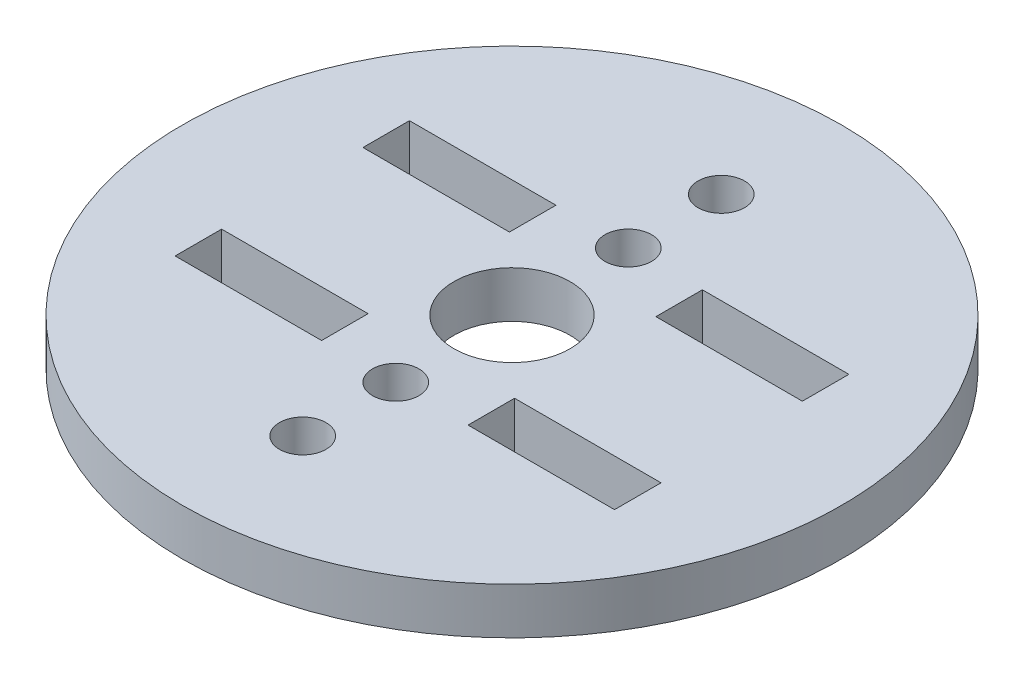
ISO-10303-21;
HEADER;
FILE_DESCRIPTION(('STEP AP214'),'2;1');
FILE_NAME('part.step','',(''),(''),'','','');
FILE_SCHEMA(('AUTOMOTIVE_DESIGN { 1 0 10303 214 1 1 1 1 }'));
ENDSEC;
DATA;
#1=APPLICATION_CONTEXT('core data for automotive mechanical design processes');
#2=APPLICATION_PROTOCOL_DEFINITION('international standard','automotive_design',2000,#1);
#3=PRODUCT_CONTEXT('',#1,'mechanical');
#4=PRODUCT('Part','Part','',(#3));
#5=PRODUCT_RELATED_PRODUCT_CATEGORY('part','',(#4));
#6=PRODUCT_DEFINITION_FORMATION('','',#4);
#7=PRODUCT_DEFINITION_CONTEXT('part definition',#1,'design');
#8=PRODUCT_DEFINITION('design','',#6,#7);
#9=PRODUCT_DEFINITION_SHAPE('','',#8);
#10=(LENGTH_UNIT() NAMED_UNIT(*) SI_UNIT(.MILLI.,.METRE.));
#11=(NAMED_UNIT(*) PLANE_ANGLE_UNIT() SI_UNIT($,.RADIAN.));
#12=(NAMED_UNIT(*) SI_UNIT($,.STERADIAN.) SOLID_ANGLE_UNIT());
#13=UNCERTAINTY_MEASURE_WITH_UNIT(LENGTH_MEASURE(1.E-05),#10,'distance_accuracy_value','');
#14=(GEOMETRIC_REPRESENTATION_CONTEXT(3) GLOBAL_UNCERTAINTY_ASSIGNED_CONTEXT((#13)) GLOBAL_UNIT_ASSIGNED_CONTEXT((#10,
#11,#12)) REPRESENTATION_CONTEXT('',''));
#15=CARTESIAN_POINT('',(0.,0.,0.));
#16=DIRECTION('',(0.,0.,1.));
#17=DIRECTION('',(1.,0.,0.));
#18=AXIS2_PLACEMENT_3D('',#15,#16,#17);
#19=CARTESIAN_POINT('',(0.,3.175,0.));
#20=DIRECTION('',(0.,1.,0.));
#21=DIRECTION('',(0.,0.,1.));
#22=AXIS2_PLACEMENT_3D('',#19,#20,#21);
#23=PLANE('',#22);
#24=CARTESIAN_POINT('',(0.,3.175,-14.2875));
#25=DIRECTION('',(0.,1.,0.));
#26=DIRECTION('',(0.,0.,1.));
#27=AXIS2_PLACEMENT_3D('',#24,#25,#26);
#28=CIRCLE('',#27,1.5875);
#29=CARTESIAN_POINT('',(0.,3.175,-12.7));
#30=VERTEX_POINT('',#29);
#31=EDGE_CURVE('E309',#30,#30,#28,.T.);
#32=ORIENTED_EDGE('',*,*,#31,.F.);
#33=EDGE_LOOP('',(#32));
#34=FACE_BOUND('',#33,.T.);
#35=CARTESIAN_POINT('',(0.,3.175,-7.9375));
#36=DIRECTION('',(0.,1.,0.));
#37=DIRECTION('',(0.,0.,1.));
#38=AXIS2_PLACEMENT_3D('',#35,#36,#37);
#39=CIRCLE('',#38,1.5875);
#40=CARTESIAN_POINT('',(0.,3.175,-6.35));
#41=VERTEX_POINT('',#40);
#42=EDGE_CURVE('E174',#41,#41,#39,.T.);
#43=ORIENTED_EDGE('',*,*,#42,.F.);
#44=EDGE_LOOP('',(#43));
#45=FACE_BOUND('',#44,.T.);
#46=DIRECTION('',(1.,0.,0.));
#47=VECTOR('',#46,1.);
#48=CARTESIAN_POINT('',(-15.,3.175,8.));
#49=LINE('',#48,#47);
#50=CARTESIAN_POINT('',(-15.,3.175,8.));
#51=VERTEX_POINT('',#50);
#52=CARTESIAN_POINT('',(-5.,3.175,8.));
#53=VERTEX_POINT('',#52);
#54=EDGE_CURVE('E186',#51,#53,#49,.T.);
#55=ORIENTED_EDGE('',*,*,#54,.F.);
#56=DIRECTION('',(0.,0.,1.));
#57=VECTOR('',#56,1.);
#58=CARTESIAN_POINT('',(-15.,3.175,4.825));
#59=LINE('',#58,#57);
#60=CARTESIAN_POINT('',(-15.,3.175,4.825));
#61=VERTEX_POINT('',#60);
#62=EDGE_CURVE('E184',#61,#51,#59,.T.);
#63=ORIENTED_EDGE('',*,*,#62,.F.);
#64=DIRECTION('',(-1.,0.,0.));
#65=VECTOR('',#64,1.);
#66=CARTESIAN_POINT('',(-15.,3.175,4.825));
#67=LINE('',#66,#65);
#68=CARTESIAN_POINT('',(-5.,3.175,4.825));
#69=VERTEX_POINT('',#68);
#70=EDGE_CURVE('E192',#69,#61,#67,.T.);
#71=ORIENTED_EDGE('',*,*,#70,.F.);
#72=DIRECTION('',(0.,0.,-1.));
#73=VECTOR('',#72,1.);
#74=CARTESIAN_POINT('',(-5.,3.175,4.825));
#75=LINE('',#74,#73);
#76=EDGE_CURVE('E189',#53,#69,#75,.T.);
#77=ORIENTED_EDGE('',*,*,#76,.F.);
#78=EDGE_LOOP('',(#55,#63,#71,#77));
#79=FACE_BOUND('',#78,.T.);
#80=DIRECTION('',(1.,0.,0.));
#81=VECTOR('',#80,1.);
#82=CARTESIAN_POINT('',(-15.,3.175,-4.825));
#83=LINE('',#82,#81);
#84=CARTESIAN_POINT('',(-15.,3.175,-4.825));
#85=VERTEX_POINT('',#84);
#86=CARTESIAN_POINT('',(-5.,3.175,-4.825));
#87=VERTEX_POINT('',#86);
#88=EDGE_CURVE('E248',#85,#87,#83,.T.);
#89=ORIENTED_EDGE('',*,*,#88,.F.);
#90=DIRECTION('',(0.,0.,1.));
#91=VECTOR('',#90,1.);
#92=CARTESIAN_POINT('',(-15.,3.175,-8.));
#93=LINE('',#92,#91);
#94=CARTESIAN_POINT('',(-15.,3.175,-8.));
#95=VERTEX_POINT('',#94);
#96=EDGE_CURVE('E246',#95,#85,#93,.T.);
#97=ORIENTED_EDGE('',*,*,#96,.F.);
#98=DIRECTION('',(-1.,0.,0.));
#99=VECTOR('',#98,1.);
#100=CARTESIAN_POINT('',(-15.,3.175,-8.));
#101=LINE('',#100,#99);
#102=CARTESIAN_POINT('',(-5.,3.175,-8.));
#103=VERTEX_POINT('',#102);
#104=EDGE_CURVE('E254',#103,#95,#101,.T.);
#105=ORIENTED_EDGE('',*,*,#104,.F.);
#106=DIRECTION('',(0.,0.,-1.));
#107=VECTOR('',#106,1.);
#108=CARTESIAN_POINT('',(-5.,3.175,-8.));
#109=LINE('',#108,#107);
#110=EDGE_CURVE('E251',#87,#103,#109,.T.);
#111=ORIENTED_EDGE('',*,*,#110,.F.);
#112=EDGE_LOOP('',(#89,#97,#105,#111));
#113=FACE_BOUND('',#112,.T.);
#114=CARTESIAN_POINT('',(0.,3.175,0.));
#115=DIRECTION('',(0.,1.,0.));
#116=DIRECTION('',(0.,0.,1.));
#117=AXIS2_PLACEMENT_3D('',#114,#115,#116);
#118=CIRCLE('',#117,22.5);
#119=CARTESIAN_POINT('',(0.,3.175,22.5));
#120=VERTEX_POINT('',#119);
#121=EDGE_CURVE('E11',#120,#120,#118,.T.);
#122=ORIENTED_EDGE('',*,*,#121,.T.);
#123=EDGE_LOOP('',(#122));
#124=FACE_BOUND('',#123,.T.);
#125=CARTESIAN_POINT('',(0.,3.175,0.));
#126=DIRECTION('',(0.,1.,0.));
#127=DIRECTION('',(0.,0.,1.));
#128=AXIS2_PLACEMENT_3D('',#125,#126,#127);
#129=CIRCLE('',#128,3.96875);
#130=CARTESIAN_POINT('',(0.,3.175,3.96875));
#131=VERTEX_POINT('',#130);
#132=EDGE_CURVE('E277',#131,#131,#129,.T.);
#133=ORIENTED_EDGE('',*,*,#132,.F.);
#134=EDGE_LOOP('',(#133));
#135=FACE_BOUND('',#134,.T.);
#136=DIRECTION('',(1.,0.,0.));
#137=VECTOR('',#136,1.);
#138=CARTESIAN_POINT('',(5.,3.175,-4.825));
#139=LINE('',#138,#137);
#140=CARTESIAN_POINT('',(5.,3.175,-4.825));
#141=VERTEX_POINT('',#140);
#142=CARTESIAN_POINT('',(15.,3.175,-4.825));
#143=VERTEX_POINT('',#142);
#144=EDGE_CURVE('E217',#141,#143,#139,.T.);
#145=ORIENTED_EDGE('',*,*,#144,.F.);
#146=DIRECTION('',(0.,0.,1.));
#147=VECTOR('',#146,1.);
#148=CARTESIAN_POINT('',(5.,3.175,-8.));
#149=LINE('',#148,#147);
#150=CARTESIAN_POINT('',(5.,3.175,-8.));
#151=VERTEX_POINT('',#150);
#152=EDGE_CURVE('E215',#151,#141,#149,.T.);
#153=ORIENTED_EDGE('',*,*,#152,.F.);
#154=DIRECTION('',(-1.,0.,0.));
#155=VECTOR('',#154,1.);
#156=CARTESIAN_POINT('',(5.,3.175,-8.));
#157=LINE('',#156,#155);
#158=CARTESIAN_POINT('',(15.,3.175,-8.));
#159=VERTEX_POINT('',#158);
#160=EDGE_CURVE('E223',#159,#151,#157,.T.);
#161=ORIENTED_EDGE('',*,*,#160,.F.);
#162=DIRECTION('',(0.,0.,-1.));
#163=VECTOR('',#162,1.);
#164=CARTESIAN_POINT('',(15.,3.175,-8.));
#165=LINE('',#164,#163);
#166=EDGE_CURVE('E220',#143,#159,#165,.T.);
#167=ORIENTED_EDGE('',*,*,#166,.F.);
#168=EDGE_LOOP('',(#145,#153,#161,#167));
#169=FACE_BOUND('',#168,.T.);
#170=DIRECTION('',(1.,0.,0.));
#171=VECTOR('',#170,1.);
#172=CARTESIAN_POINT('',(5.,3.175,8.));
#173=LINE('',#172,#171);
#174=CARTESIAN_POINT('',(5.,3.175,8.));
#175=VERTEX_POINT('',#174);
#176=CARTESIAN_POINT('',(15.,3.175,8.));
#177=VERTEX_POINT('',#176);
#178=EDGE_CURVE('E153',#175,#177,#173,.T.);
#179=ORIENTED_EDGE('',*,*,#178,.F.);
#180=DIRECTION('',(0.,0.,1.));
#181=VECTOR('',#180,1.);
#182=CARTESIAN_POINT('',(5.,3.175,4.825));
#183=LINE('',#182,#181);
#184=CARTESIAN_POINT('',(5.,3.175,4.825));
#185=VERTEX_POINT('',#184);
#186=EDGE_CURVE('E145',#185,#175,#183,.T.);
#187=ORIENTED_EDGE('',*,*,#186,.F.);
#188=DIRECTION('',(-1.,0.,0.));
#189=VECTOR('',#188,1.);
#190=CARTESIAN_POINT('',(5.,3.175,4.825));
#191=LINE('',#190,#189);
#192=CARTESIAN_POINT('',(15.,3.175,4.825));
#193=VERTEX_POINT('',#192);
#194=EDGE_CURVE('E168',#193,#185,#191,.T.);
#195=ORIENTED_EDGE('',*,*,#194,.F.);
#196=DIRECTION('',(0.,0.,-1.));
#197=VECTOR('',#196,1.);
#198=CARTESIAN_POINT('',(15.,3.175,4.825));
#199=LINE('',#198,#197);
#200=EDGE_CURVE('E166',#177,#193,#199,.T.);
#201=ORIENTED_EDGE('',*,*,#200,.F.);
#202=EDGE_LOOP('',(#179,#187,#195,#201));
#203=FACE_BOUND('',#202,.T.);
#204=CARTESIAN_POINT('',(0.,3.175,7.9375));
#205=DIRECTION('',(0.,1.,0.));
#206=DIRECTION('',(0.,0.,1.));
#207=AXIS2_PLACEMENT_3D('',#204,#205,#206);
#208=CIRCLE('',#207,1.5875);
#209=CARTESIAN_POINT('',(0.,3.175,9.525));
#210=VERTEX_POINT('',#209);
#211=EDGE_CURVE('E538',#210,#210,#208,.T.);
#212=ORIENTED_EDGE('',*,*,#211,.F.);
#213=EDGE_LOOP('',(#212));
#214=FACE_BOUND('',#213,.T.);
#215=CARTESIAN_POINT('',(0.,3.175,14.2875));
#216=DIRECTION('',(0.,1.,0.));
#217=DIRECTION('',(0.,0.,1.));
#218=AXIS2_PLACEMENT_3D('',#215,#216,#217);
#219=CIRCLE('',#218,1.5875);
#220=CARTESIAN_POINT('',(0.,3.175,15.875));
#221=VERTEX_POINT('',#220);
#222=EDGE_CURVE('E525',#221,#221,#219,.T.);
#223=ORIENTED_EDGE('',*,*,#222,.F.);
#224=EDGE_LOOP('',(#223));
#225=FACE_BOUND('',#224,.T.);
#226=ADVANCED_FACE('F32',(#34,#45,#79,#113,#124,#135,#169,#203,#214,#225),#23,.T.);
#227=CARTESIAN_POINT('',(0.,0.,0.));
#228=DIRECTION('',(0.,1.,0.));
#229=DIRECTION('',(0.,0.,1.));
#230=AXIS2_PLACEMENT_3D('',#227,#228,#229);
#231=PLANE('',#230);
#232=CARTESIAN_POINT('',(0.,0.,-14.2875));
#233=DIRECTION('',(0.,1.,0.));
#234=DIRECTION('',(0.,0.,1.));
#235=AXIS2_PLACEMENT_3D('',#232,#233,#234);
#236=CIRCLE('',#235,1.5875);
#237=CARTESIAN_POINT('',(0.,0.,-12.7));
#238=VERTEX_POINT('',#237);
#239=EDGE_CURVE('E531',#238,#238,#236,.T.);
#240=ORIENTED_EDGE('',*,*,#239,.T.);
#241=EDGE_LOOP('',(#240));
#242=FACE_BOUND('',#241,.T.);
#243=CARTESIAN_POINT('',(0.,0.,-7.9375));
#244=DIRECTION('',(0.,1.,0.));
#245=DIRECTION('',(0.,0.,1.));
#246=AXIS2_PLACEMENT_3D('',#243,#244,#245);
#247=CIRCLE('',#246,1.5875);
#248=CARTESIAN_POINT('',(0.,0.,-6.35));
#249=VERTEX_POINT('',#248);
#250=EDGE_CURVE('E541',#249,#249,#247,.T.);
#251=ORIENTED_EDGE('',*,*,#250,.T.);
#252=EDGE_LOOP('',(#251));
#253=FACE_BOUND('',#252,.T.);
#254=DIRECTION('',(0.,0.,1.));
#255=VECTOR('',#254,1.);
#256=CARTESIAN_POINT('',(-15.,0.,4.825));
#257=LINE('',#256,#255);
#258=CARTESIAN_POINT('',(-15.,0.,4.825));
#259=VERTEX_POINT('',#258);
#260=CARTESIAN_POINT('',(-15.,0.,8.));
#261=VERTEX_POINT('',#260);
#262=EDGE_CURVE('E161',#259,#261,#257,.T.);
#263=ORIENTED_EDGE('',*,*,#262,.T.);
#264=DIRECTION('',(1.,0.,0.));
#265=VECTOR('',#264,1.);
#266=CARTESIAN_POINT('',(-15.,0.,8.));
#267=LINE('',#266,#265);
#268=CARTESIAN_POINT('',(-5.,0.,8.));
#269=VERTEX_POINT('',#268);
#270=EDGE_CURVE('E197',#261,#269,#267,.T.);
#271=ORIENTED_EDGE('',*,*,#270,.T.);
#272=DIRECTION('',(0.,0.,-1.));
#273=VECTOR('',#272,1.);
#274=CARTESIAN_POINT('',(-5.,0.,4.825));
#275=LINE('',#274,#273);
#276=CARTESIAN_POINT('',(-5.,0.,4.825));
#277=VERTEX_POINT('',#276);
#278=EDGE_CURVE('E200',#269,#277,#275,.T.);
#279=ORIENTED_EDGE('',*,*,#278,.T.);
#280=DIRECTION('',(-1.,0.,0.));
#281=VECTOR('',#280,1.);
#282=CARTESIAN_POINT('',(-15.,0.,4.825));
#283=LINE('',#282,#281);
#284=EDGE_CURVE('E187',#277,#259,#283,.T.);
#285=ORIENTED_EDGE('',*,*,#284,.T.);
#286=EDGE_LOOP('',(#263,#271,#279,#285));
#287=FACE_BOUND('',#286,.T.);
#288=DIRECTION('',(0.,0.,1.));
#289=VECTOR('',#288,1.);
#290=CARTESIAN_POINT('',(-15.,0.,-8.));
#291=LINE('',#290,#289);
#292=CARTESIAN_POINT('',(-15.,0.,-8.));
#293=VERTEX_POINT('',#292);
#294=CARTESIAN_POINT('',(-15.,0.,-4.825));
#295=VERTEX_POINT('',#294);
#296=EDGE_CURVE('E245',#293,#295,#291,.T.);
#297=ORIENTED_EDGE('',*,*,#296,.T.);
#298=DIRECTION('',(1.,0.,0.));
#299=VECTOR('',#298,1.);
#300=CARTESIAN_POINT('',(-15.,0.,-4.825));
#301=LINE('',#300,#299);
#302=CARTESIAN_POINT('',(-5.,0.,-4.825));
#303=VERTEX_POINT('',#302);
#304=EDGE_CURVE('E259',#295,#303,#301,.T.);
#305=ORIENTED_EDGE('',*,*,#304,.T.);
#306=DIRECTION('',(0.,0.,-1.));
#307=VECTOR('',#306,1.);
#308=CARTESIAN_POINT('',(-5.,0.,-8.));
#309=LINE('',#308,#307);
#310=CARTESIAN_POINT('',(-5.,0.,-8.));
#311=VERTEX_POINT('',#310);
#312=EDGE_CURVE('E262',#303,#311,#309,.T.);
#313=ORIENTED_EDGE('',*,*,#312,.T.);
#314=DIRECTION('',(-1.,0.,0.));
#315=VECTOR('',#314,1.);
#316=CARTESIAN_POINT('',(-15.,0.,-8.));
#317=LINE('',#316,#315);
#318=EDGE_CURVE('E249',#311,#293,#317,.T.);
#319=ORIENTED_EDGE('',*,*,#318,.T.);
#320=EDGE_LOOP('',(#297,#305,#313,#319));
#321=FACE_BOUND('',#320,.T.);
#322=CARTESIAN_POINT('',(0.,0.,0.));
#323=DIRECTION('',(0.,1.,0.));
#324=DIRECTION('',(0.,0.,1.));
#325=AXIS2_PLACEMENT_3D('',#322,#323,#324);
#326=CIRCLE('',#325,22.5);
#327=CARTESIAN_POINT('',(0.,0.,22.5));
#328=VERTEX_POINT('',#327);
#329=EDGE_CURVE('E36',#328,#328,#326,.T.);
#330=ORIENTED_EDGE('',*,*,#329,.F.);
#331=EDGE_LOOP('',(#330));
#332=FACE_BOUND('',#331,.T.);
#333=CARTESIAN_POINT('',(0.,0.,0.));
#334=DIRECTION('',(0.,1.,0.));
#335=DIRECTION('',(0.,0.,1.));
#336=AXIS2_PLACEMENT_3D('',#333,#334,#335);
#337=CIRCLE('',#336,3.96875);
#338=CARTESIAN_POINT('',(0.,0.,3.96875));
#339=VERTEX_POINT('',#338);
#340=EDGE_CURVE('E276',#339,#339,#337,.T.);
#341=ORIENTED_EDGE('',*,*,#340,.T.);
#342=EDGE_LOOP('',(#341));
#343=FACE_BOUND('',#342,.T.);
#344=DIRECTION('',(0.,0.,1.));
#345=VECTOR('',#344,1.);
#346=CARTESIAN_POINT('',(5.,0.,-8.));
#347=LINE('',#346,#345);
#348=CARTESIAN_POINT('',(5.,0.,-8.));
#349=VERTEX_POINT('',#348);
#350=CARTESIAN_POINT('',(5.,0.,-4.825));
#351=VERTEX_POINT('',#350);
#352=EDGE_CURVE('E214',#349,#351,#347,.T.);
#353=ORIENTED_EDGE('',*,*,#352,.T.);
#354=DIRECTION('',(1.,0.,0.));
#355=VECTOR('',#354,1.);
#356=CARTESIAN_POINT('',(5.,0.,-4.825));
#357=LINE('',#356,#355);
#358=CARTESIAN_POINT('',(15.,0.,-4.825));
#359=VERTEX_POINT('',#358);
#360=EDGE_CURVE('E228',#351,#359,#357,.T.);
#361=ORIENTED_EDGE('',*,*,#360,.T.);
#362=DIRECTION('',(0.,0.,-1.));
#363=VECTOR('',#362,1.);
#364=CARTESIAN_POINT('',(15.,0.,-8.));
#365=LINE('',#364,#363);
#366=CARTESIAN_POINT('',(15.,0.,-8.));
#367=VERTEX_POINT('',#366);
#368=EDGE_CURVE('E231',#359,#367,#365,.T.);
#369=ORIENTED_EDGE('',*,*,#368,.T.);
#370=DIRECTION('',(-1.,0.,0.));
#371=VECTOR('',#370,1.);
#372=CARTESIAN_POINT('',(5.,0.,-8.));
#373=LINE('',#372,#371);
#374=EDGE_CURVE('E218',#367,#349,#373,.T.);
#375=ORIENTED_EDGE('',*,*,#374,.T.);
#376=EDGE_LOOP('',(#353,#361,#369,#375));
#377=FACE_BOUND('',#376,.T.);
#378=DIRECTION('',(0.,0.,1.));
#379=VECTOR('',#378,1.);
#380=CARTESIAN_POINT('',(5.,0.,4.825));
#381=LINE('',#380,#379);
#382=CARTESIAN_POINT('',(5.,0.,4.825));
#383=VERTEX_POINT('',#382);
#384=CARTESIAN_POINT('',(5.,0.,8.));
#385=VERTEX_POINT('',#384);
#386=EDGE_CURVE('E55',#383,#385,#381,.T.);
#387=ORIENTED_EDGE('',*,*,#386,.T.);
#388=DIRECTION('',(1.,0.,0.));
#389=VECTOR('',#388,1.);
#390=CARTESIAN_POINT('',(5.,0.,8.));
#391=LINE('',#390,#389);
#392=CARTESIAN_POINT('',(15.,0.,8.));
#393=VERTEX_POINT('',#392);
#394=EDGE_CURVE('E160',#385,#393,#391,.T.);
#395=ORIENTED_EDGE('',*,*,#394,.T.);
#396=DIRECTION('',(0.,0.,-1.));
#397=VECTOR('',#396,1.);
#398=CARTESIAN_POINT('',(15.,0.,4.825));
#399=LINE('',#398,#397);
#400=CARTESIAN_POINT('',(15.,0.,4.825));
#401=VERTEX_POINT('',#400);
#402=EDGE_CURVE('E176',#393,#401,#399,.T.);
#403=ORIENTED_EDGE('',*,*,#402,.T.);
#404=DIRECTION('',(-1.,0.,0.));
#405=VECTOR('',#404,1.);
#406=CARTESIAN_POINT('',(5.,0.,4.825));
#407=LINE('',#406,#405);
#408=EDGE_CURVE('E154',#401,#383,#407,.T.);
#409=ORIENTED_EDGE('',*,*,#408,.T.);
#410=EDGE_LOOP('',(#387,#395,#403,#409));
#411=FACE_BOUND('',#410,.T.);
#412=CARTESIAN_POINT('',(0.,0.,7.9375));
#413=DIRECTION('',(0.,1.,0.));
#414=DIRECTION('',(0.,0.,1.));
#415=AXIS2_PLACEMENT_3D('',#412,#413,#414);
#416=CIRCLE('',#415,1.5875);
#417=CARTESIAN_POINT('',(0.,0.,9.525));
#418=VERTEX_POINT('',#417);
#419=EDGE_CURVE('E535',#418,#418,#416,.T.);
#420=ORIENTED_EDGE('',*,*,#419,.T.);
#421=EDGE_LOOP('',(#420));
#422=FACE_BOUND('',#421,.T.);
#423=CARTESIAN_POINT('',(0.,0.,14.2875));
#424=DIRECTION('',(0.,1.,0.));
#425=DIRECTION('',(0.,0.,1.));
#426=AXIS2_PLACEMENT_3D('',#423,#424,#425);
#427=CIRCLE('',#426,1.5875);
#428=CARTESIAN_POINT('',(0.,0.,15.875));
#429=VERTEX_POINT('',#428);
#430=EDGE_CURVE('E528',#429,#429,#427,.T.);
#431=ORIENTED_EDGE('',*,*,#430,.T.);
#432=EDGE_LOOP('',(#431));
#433=FACE_BOUND('',#432,.T.);
#434=ADVANCED_FACE('F283',(#242,#253,#287,#321,#332,#343,#377,#411,#422,#433),#231,.F.);
#435=CARTESIAN_POINT('',(0.,3.175,0.));
#436=DIRECTION('',(0.,-1.,0.));
#437=DIRECTION('',(0.,0.,-1.));
#438=AXIS2_PLACEMENT_3D('',#435,#436,#437);
#439=CYLINDRICAL_SURFACE('',#438,22.5);
#440=ORIENTED_EDGE('',*,*,#121,.F.);
#441=EDGE_LOOP('',(#440));
#442=FACE_BOUND('',#441,.T.);
#443=ORIENTED_EDGE('',*,*,#329,.T.);
#444=EDGE_LOOP('',(#443));
#445=FACE_BOUND('',#444,.T.);
#446=ADVANCED_FACE('F34',(#442,#445),#439,.T.);
#447=CARTESIAN_POINT('',(0.,3.175,0.));
#448=DIRECTION('',(0.,-1.,0.));
#449=DIRECTION('',(0.,0.,-1.));
#450=AXIS2_PLACEMENT_3D('',#447,#448,#449);
#451=CYLINDRICAL_SURFACE('',#450,3.96875);
#452=ORIENTED_EDGE('',*,*,#132,.T.);
#453=EDGE_LOOP('',(#452));
#454=FACE_BOUND('',#453,.T.);
#455=ORIENTED_EDGE('',*,*,#340,.F.);
#456=EDGE_LOOP('',(#455));
#457=FACE_BOUND('',#456,.T.);
#458=ADVANCED_FACE('F286',(#454,#457),#451,.F.);
#459=CARTESIAN_POINT('',(-15.,3.175,-8.));
#460=DIRECTION('',(1.,0.,0.));
#461=DIRECTION('',(0.,0.,-1.));
#462=AXIS2_PLACEMENT_3D('',#459,#460,#461);
#463=PLANE('',#462);
#464=ORIENTED_EDGE('',*,*,#296,.F.);
#465=DIRECTION('',(0.,-1.,0.));
#466=VECTOR('',#465,1.);
#467=CARTESIAN_POINT('',(-15.,3.175,-8.));
#468=LINE('',#467,#466);
#469=EDGE_CURVE('E256',#95,#293,#468,.T.);
#470=ORIENTED_EDGE('',*,*,#469,.F.);
#471=ORIENTED_EDGE('',*,*,#96,.T.);
#472=DIRECTION('',(0.,-1.,0.));
#473=VECTOR('',#472,1.);
#474=CARTESIAN_POINT('',(-15.,3.175,-4.825));
#475=LINE('',#474,#473);
#476=EDGE_CURVE('E273',#85,#295,#475,.T.);
#477=ORIENTED_EDGE('',*,*,#476,.T.);
#478=EDGE_LOOP('',(#464,#470,#471,#477));
#479=FACE_BOUND('',#478,.T.);
#480=ADVANCED_FACE('F288',(#479),#463,.T.);
#481=CARTESIAN_POINT('',(-15.,3.175,-4.825));
#482=DIRECTION('',(0.,0.,-1.));
#483=DIRECTION('',(-1.,0.,0.));
#484=AXIS2_PLACEMENT_3D('',#481,#482,#483);
#485=PLANE('',#484);
#486=ORIENTED_EDGE('',*,*,#304,.F.);
#487=ORIENTED_EDGE('',*,*,#476,.F.);
#488=ORIENTED_EDGE('',*,*,#88,.T.);
#489=DIRECTION('',(0.,-1.,0.));
#490=VECTOR('',#489,1.);
#491=CARTESIAN_POINT('',(-5.,3.175,-4.825));
#492=LINE('',#491,#490);
#493=EDGE_CURVE('E271',#87,#303,#492,.T.);
#494=ORIENTED_EDGE('',*,*,#493,.T.);
#495=EDGE_LOOP('',(#486,#487,#488,#494));
#496=FACE_BOUND('',#495,.T.);
#497=ADVANCED_FACE('F295',(#496),#485,.T.);
#498=CARTESIAN_POINT('',(-5.,3.175,-8.));
#499=DIRECTION('',(-1.,0.,0.));
#500=DIRECTION('',(0.,0.,1.));
#501=AXIS2_PLACEMENT_3D('',#498,#499,#500);
#502=PLANE('',#501);
#503=ORIENTED_EDGE('',*,*,#312,.F.);
#504=ORIENTED_EDGE('',*,*,#493,.F.);
#505=ORIENTED_EDGE('',*,*,#110,.T.);
#506=DIRECTION('',(0.,-1.,0.));
#507=VECTOR('',#506,1.);
#508=CARTESIAN_POINT('',(-5.,3.175,-8.));
#509=LINE('',#508,#507);
#510=EDGE_CURVE('E269',#103,#311,#509,.T.);
#511=ORIENTED_EDGE('',*,*,#510,.T.);
#512=EDGE_LOOP('',(#503,#504,#505,#511));
#513=FACE_BOUND('',#512,.T.);
#514=ADVANCED_FACE('F363',(#513),#502,.T.);
#515=CARTESIAN_POINT('',(-15.,3.175,-8.));
#516=DIRECTION('',(0.,0.,1.));
#517=DIRECTION('',(1.,0.,0.));
#518=AXIS2_PLACEMENT_3D('',#515,#516,#517);
#519=PLANE('',#518);
#520=ORIENTED_EDGE('',*,*,#318,.F.);
#521=ORIENTED_EDGE('',*,*,#510,.F.);
#522=ORIENTED_EDGE('',*,*,#104,.T.);
#523=ORIENTED_EDGE('',*,*,#469,.T.);
#524=EDGE_LOOP('',(#520,#521,#522,#523));
#525=FACE_BOUND('',#524,.T.);
#526=ADVANCED_FACE('F360',(#525),#519,.T.);
#527=CARTESIAN_POINT('',(5.,3.175,-8.));
#528=DIRECTION('',(1.,0.,0.));
#529=DIRECTION('',(0.,0.,-1.));
#530=AXIS2_PLACEMENT_3D('',#527,#528,#529);
#531=PLANE('',#530);
#532=ORIENTED_EDGE('',*,*,#352,.F.);
#533=DIRECTION('',(0.,-1.,0.));
#534=VECTOR('',#533,1.);
#535=CARTESIAN_POINT('',(5.,3.175,-8.));
#536=LINE('',#535,#534);
#537=EDGE_CURVE('E225',#151,#349,#536,.T.);
#538=ORIENTED_EDGE('',*,*,#537,.F.);
#539=ORIENTED_EDGE('',*,*,#152,.T.);
#540=DIRECTION('',(0.,-1.,0.));
#541=VECTOR('',#540,1.);
#542=CARTESIAN_POINT('',(5.,3.175,-4.825));
#543=LINE('',#542,#541);
#544=EDGE_CURVE('E242',#141,#351,#543,.T.);
#545=ORIENTED_EDGE('',*,*,#544,.T.);
#546=EDGE_LOOP('',(#532,#538,#539,#545));
#547=FACE_BOUND('',#546,.T.);
#548=ADVANCED_FACE('F339',(#547),#531,.T.);
#549=CARTESIAN_POINT('',(5.,3.175,-4.825));
#550=DIRECTION('',(0.,0.,-1.));
#551=DIRECTION('',(-1.,0.,0.));
#552=AXIS2_PLACEMENT_3D('',#549,#550,#551);
#553=PLANE('',#552);
#554=ORIENTED_EDGE('',*,*,#360,.F.);
#555=ORIENTED_EDGE('',*,*,#544,.F.);
#556=ORIENTED_EDGE('',*,*,#144,.T.);
#557=DIRECTION('',(0.,-1.,0.));
#558=VECTOR('',#557,1.);
#559=CARTESIAN_POINT('',(15.,3.175,-4.825));
#560=LINE('',#559,#558);
#561=EDGE_CURVE('E240',#143,#359,#560,.T.);
#562=ORIENTED_EDGE('',*,*,#561,.T.);
#563=EDGE_LOOP('',(#554,#555,#556,#562));
#564=FACE_BOUND('',#563,.T.);
#565=ADVANCED_FACE('F332',(#564),#553,.T.);
#566=CARTESIAN_POINT('',(15.,3.175,-8.));
#567=DIRECTION('',(-1.,0.,0.));
#568=DIRECTION('',(0.,0.,1.));
#569=AXIS2_PLACEMENT_3D('',#566,#567,#568);
#570=PLANE('',#569);
#571=ORIENTED_EDGE('',*,*,#368,.F.);
#572=ORIENTED_EDGE('',*,*,#561,.F.);
#573=ORIENTED_EDGE('',*,*,#166,.T.);
#574=DIRECTION('',(0.,-1.,0.));
#575=VECTOR('',#574,1.);
#576=CARTESIAN_POINT('',(15.,3.175,-8.));
#577=LINE('',#576,#575);
#578=EDGE_CURVE('E238',#159,#367,#577,.T.);
#579=ORIENTED_EDGE('',*,*,#578,.T.);
#580=EDGE_LOOP('',(#571,#572,#573,#579));
#581=FACE_BOUND('',#580,.T.);
#582=ADVANCED_FACE('F335',(#581),#570,.T.);
#583=CARTESIAN_POINT('',(5.,3.175,-8.));
#584=DIRECTION('',(0.,0.,1.));
#585=DIRECTION('',(1.,0.,0.));
#586=AXIS2_PLACEMENT_3D('',#583,#584,#585);
#587=PLANE('',#586);
#588=ORIENTED_EDGE('',*,*,#374,.F.);
#589=ORIENTED_EDGE('',*,*,#578,.F.);
#590=ORIENTED_EDGE('',*,*,#160,.T.);
#591=ORIENTED_EDGE('',*,*,#537,.T.);
#592=EDGE_LOOP('',(#588,#589,#590,#591));
#593=FACE_BOUND('',#592,.T.);
#594=ADVANCED_FACE('F342',(#593),#587,.T.);
#595=CARTESIAN_POINT('',(-15.,3.175,4.825));
#596=DIRECTION('',(1.,0.,0.));
#597=DIRECTION('',(0.,0.,-1.));
#598=AXIS2_PLACEMENT_3D('',#595,#596,#597);
#599=PLANE('',#598);
#600=ORIENTED_EDGE('',*,*,#262,.F.);
#601=DIRECTION('',(0.,-1.,0.));
#602=VECTOR('',#601,1.);
#603=CARTESIAN_POINT('',(-15.,3.175,4.825));
#604=LINE('',#603,#602);
#605=EDGE_CURVE('E194',#61,#259,#604,.T.);
#606=ORIENTED_EDGE('',*,*,#605,.F.);
#607=ORIENTED_EDGE('',*,*,#62,.T.);
#608=DIRECTION('',(0.,-1.,0.));
#609=VECTOR('',#608,1.);
#610=CARTESIAN_POINT('',(-15.,3.175,8.));
#611=LINE('',#610,#609);
#612=EDGE_CURVE('E211',#51,#261,#611,.T.);
#613=ORIENTED_EDGE('',*,*,#612,.T.);
#614=EDGE_LOOP('',(#600,#606,#607,#613));
#615=FACE_BOUND('',#614,.T.);
#616=ADVANCED_FACE('F344',(#615),#599,.T.);
#617=CARTESIAN_POINT('',(-15.,3.175,8.));
#618=DIRECTION('',(0.,0.,-1.));
#619=DIRECTION('',(-1.,0.,0.));
#620=AXIS2_PLACEMENT_3D('',#617,#618,#619);
#621=PLANE('',#620);
#622=ORIENTED_EDGE('',*,*,#270,.F.);
#623=ORIENTED_EDGE('',*,*,#612,.F.);
#624=ORIENTED_EDGE('',*,*,#54,.T.);
#625=DIRECTION('',(0.,-1.,0.));
#626=VECTOR('',#625,1.);
#627=CARTESIAN_POINT('',(-5.,3.175,8.));
#628=LINE('',#627,#626);
#629=EDGE_CURVE('E209',#53,#269,#628,.T.);
#630=ORIENTED_EDGE('',*,*,#629,.T.);
#631=EDGE_LOOP('',(#622,#623,#624,#630));
#632=FACE_BOUND('',#631,.T.);
#633=ADVANCED_FACE('F350',(#632),#621,.T.);
#634=CARTESIAN_POINT('',(-5.,3.175,4.825));
#635=DIRECTION('',(-1.,0.,0.));
#636=DIRECTION('',(0.,0.,1.));
#637=AXIS2_PLACEMENT_3D('',#634,#635,#636);
#638=PLANE('',#637);
#639=ORIENTED_EDGE('',*,*,#278,.F.);
#640=ORIENTED_EDGE('',*,*,#629,.F.);
#641=ORIENTED_EDGE('',*,*,#76,.T.);
#642=DIRECTION('',(0.,-1.,0.));
#643=VECTOR('',#642,1.);
#644=CARTESIAN_POINT('',(-5.,3.175,4.825));
#645=LINE('',#644,#643);
#646=EDGE_CURVE('E207',#69,#277,#645,.T.);
#647=ORIENTED_EDGE('',*,*,#646,.T.);
#648=EDGE_LOOP('',(#639,#640,#641,#647));
#649=FACE_BOUND('',#648,.T.);
#650=ADVANCED_FACE('F424',(#649),#638,.T.);
#651=CARTESIAN_POINT('',(-15.,3.175,4.825));
#652=DIRECTION('',(0.,0.,1.));
#653=DIRECTION('',(1.,0.,0.));
#654=AXIS2_PLACEMENT_3D('',#651,#652,#653);
#655=PLANE('',#654);
#656=ORIENTED_EDGE('',*,*,#284,.F.);
#657=ORIENTED_EDGE('',*,*,#646,.F.);
#658=ORIENTED_EDGE('',*,*,#70,.T.);
#659=ORIENTED_EDGE('',*,*,#605,.T.);
#660=EDGE_LOOP('',(#656,#657,#658,#659));
#661=FACE_BOUND('',#660,.T.);
#662=ADVANCED_FACE('F433',(#661),#655,.T.);
#663=CARTESIAN_POINT('',(5.,3.175,4.825));
#664=DIRECTION('',(1.,0.,0.));
#665=DIRECTION('',(0.,0.,-1.));
#666=AXIS2_PLACEMENT_3D('',#663,#664,#665);
#667=PLANE('',#666);
#668=ORIENTED_EDGE('',*,*,#386,.F.);
#669=DIRECTION('',(0.,-1.,0.));
#670=VECTOR('',#669,1.);
#671=CARTESIAN_POINT('',(5.,3.175,4.825));
#672=LINE('',#671,#670);
#673=EDGE_CURVE('E149',#185,#383,#672,.T.);
#674=ORIENTED_EDGE('',*,*,#673,.F.);
#675=ORIENTED_EDGE('',*,*,#186,.T.);
#676=DIRECTION('',(0.,-1.,0.));
#677=VECTOR('',#676,1.);
#678=CARTESIAN_POINT('',(5.,3.175,8.));
#679=LINE('',#678,#677);
#680=EDGE_CURVE('E148',#175,#385,#679,.T.);
#681=ORIENTED_EDGE('',*,*,#680,.T.);
#682=EDGE_LOOP('',(#668,#674,#675,#681));
#683=FACE_BOUND('',#682,.T.);
#684=ADVANCED_FACE('F147',(#683),#667,.T.);
#685=CARTESIAN_POINT('',(5.,3.175,8.));
#686=DIRECTION('',(0.,0.,-1.));
#687=DIRECTION('',(-1.,0.,0.));
#688=AXIS2_PLACEMENT_3D('',#685,#686,#687);
#689=PLANE('',#688);
#690=ORIENTED_EDGE('',*,*,#394,.F.);
#691=ORIENTED_EDGE('',*,*,#680,.F.);
#692=ORIENTED_EDGE('',*,*,#178,.T.);
#693=DIRECTION('',(0.,-1.,0.));
#694=VECTOR('',#693,1.);
#695=CARTESIAN_POINT('',(15.,3.175,8.));
#696=LINE('',#695,#694);
#697=EDGE_CURVE('E162',#177,#393,#696,.T.);
#698=ORIENTED_EDGE('',*,*,#697,.T.);
#699=EDGE_LOOP('',(#690,#691,#692,#698));
#700=FACE_BOUND('',#699,.T.);
#701=ADVANCED_FACE('F157',(#700),#689,.T.);
#702=CARTESIAN_POINT('',(15.,3.175,4.825));
#703=DIRECTION('',(-1.,0.,0.));
#704=DIRECTION('',(0.,0.,1.));
#705=AXIS2_PLACEMENT_3D('',#702,#703,#704);
#706=PLANE('',#705);
#707=ORIENTED_EDGE('',*,*,#402,.F.);
#708=ORIENTED_EDGE('',*,*,#697,.F.);
#709=ORIENTED_EDGE('',*,*,#200,.T.);
#710=DIRECTION('',(0.,-1.,0.));
#711=VECTOR('',#710,1.);
#712=CARTESIAN_POINT('',(15.,3.175,4.825));
#713=LINE('',#712,#711);
#714=EDGE_CURVE('E47',#193,#401,#713,.T.);
#715=ORIENTED_EDGE('',*,*,#714,.T.);
#716=EDGE_LOOP('',(#707,#708,#709,#715));
#717=FACE_BOUND('',#716,.T.);
#718=ADVANCED_FACE('F460',(#717),#706,.T.);
#719=CARTESIAN_POINT('',(5.,3.175,4.825));
#720=DIRECTION('',(0.,0.,1.));
#721=DIRECTION('',(1.,0.,0.));
#722=AXIS2_PLACEMENT_3D('',#719,#720,#721);
#723=PLANE('',#722);
#724=ORIENTED_EDGE('',*,*,#408,.F.);
#725=ORIENTED_EDGE('',*,*,#714,.F.);
#726=ORIENTED_EDGE('',*,*,#194,.T.);
#727=ORIENTED_EDGE('',*,*,#673,.T.);
#728=EDGE_LOOP('',(#724,#725,#726,#727));
#729=FACE_BOUND('',#728,.T.);
#730=ADVANCED_FACE('F469',(#729),#723,.T.);
#731=CARTESIAN_POINT('',(0.,3.175,-7.9375));
#732=DIRECTION('',(0.,-1.,0.));
#733=DIRECTION('',(0.,0.,-1.));
#734=AXIS2_PLACEMENT_3D('',#731,#732,#733);
#735=CYLINDRICAL_SURFACE('',#734,1.5875);
#736=ORIENTED_EDGE('',*,*,#42,.T.);
#737=EDGE_LOOP('',(#736));
#738=FACE_BOUND('',#737,.T.);
#739=ORIENTED_EDGE('',*,*,#250,.F.);
#740=EDGE_LOOP('',(#739));
#741=FACE_BOUND('',#740,.T.);
#742=ADVANCED_FACE('F479',(#738,#741),#735,.F.);
#743=CARTESIAN_POINT('',(0.,3.175,7.9375));
#744=DIRECTION('',(0.,-1.,0.));
#745=DIRECTION('',(0.,0.,-1.));
#746=AXIS2_PLACEMENT_3D('',#743,#744,#745);
#747=CYLINDRICAL_SURFACE('',#746,1.5875);
#748=ORIENTED_EDGE('',*,*,#211,.T.);
#749=EDGE_LOOP('',(#748));
#750=FACE_BOUND('',#749,.T.);
#751=ORIENTED_EDGE('',*,*,#419,.F.);
#752=EDGE_LOOP('',(#751));
#753=FACE_BOUND('',#752,.T.);
#754=ADVANCED_FACE('F488',(#750,#753),#747,.F.);
#755=CARTESIAN_POINT('',(0.,3.175,-14.2875));
#756=DIRECTION('',(0.,-1.,0.));
#757=DIRECTION('',(0.,0.,-1.));
#758=AXIS2_PLACEMENT_3D('',#755,#756,#757);
#759=CYLINDRICAL_SURFACE('',#758,1.5875);
#760=ORIENTED_EDGE('',*,*,#31,.T.);
#761=EDGE_LOOP('',(#760));
#762=FACE_BOUND('',#761,.T.);
#763=ORIENTED_EDGE('',*,*,#239,.F.);
#764=EDGE_LOOP('',(#763));
#765=FACE_BOUND('',#764,.T.);
#766=ADVANCED_FACE('F498',(#762,#765),#759,.F.);
#767=CARTESIAN_POINT('',(0.,3.175,14.2875));
#768=DIRECTION('',(0.,-1.,0.));
#769=DIRECTION('',(0.,0.,-1.));
#770=AXIS2_PLACEMENT_3D('',#767,#768,#769);
#771=CYLINDRICAL_SURFACE('',#770,1.5875);
#772=ORIENTED_EDGE('',*,*,#222,.T.);
#773=EDGE_LOOP('',(#772));
#774=FACE_BOUND('',#773,.T.);
#775=ORIENTED_EDGE('',*,*,#430,.F.);
#776=EDGE_LOOP('',(#775));
#777=FACE_BOUND('',#776,.T.);
#778=ADVANCED_FACE('F508',(#774,#777),#771,.F.);
#779=CLOSED_SHELL('',(#226,#434,#446,#458,#480,#497,#514,#526,#548,#565,#582,#594,#616,#633,
#650,#662,#684,#701,#718,#730,#742,#754,#766,#778));
#780=MANIFOLD_SOLID_BREP('B2',#779);
#781=ADVANCED_BREP_SHAPE_REPRESENTATION('',(#18,#780),#14);
#782=SHAPE_DEFINITION_REPRESENTATION(#9,#781);
ENDSEC;
END-ISO-10303-21;
